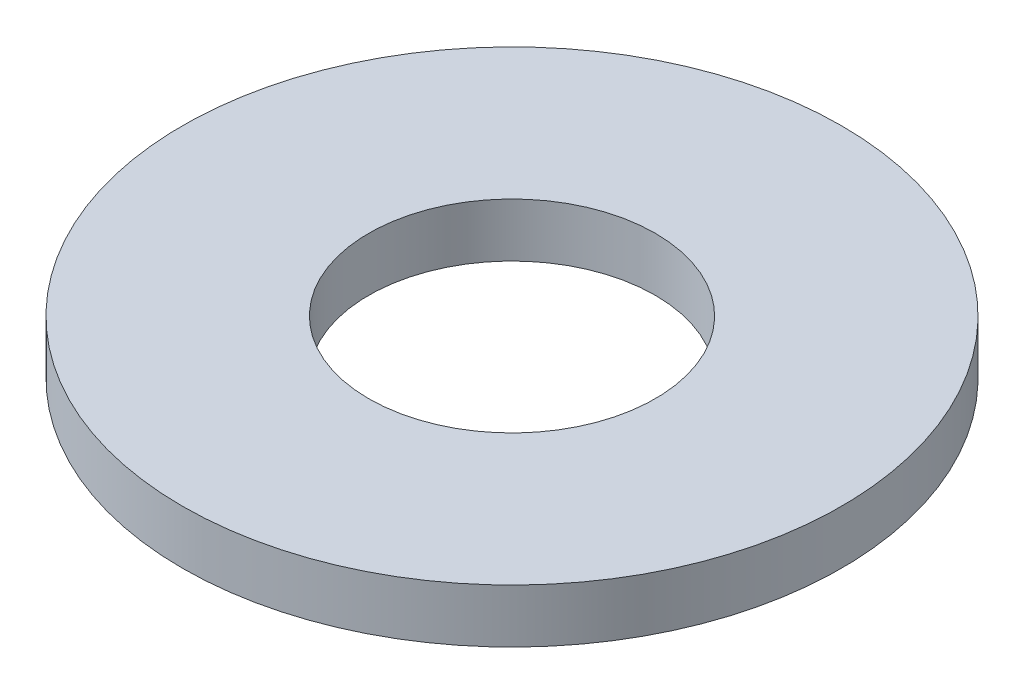
ISO-10303-21;
HEADER;
FILE_DESCRIPTION(('STEP AP214'),'2;1');
FILE_NAME('part.step','',(''),(''),'','','');
FILE_SCHEMA(('AUTOMOTIVE_DESIGN { 1 0 10303 214 1 1 1 1 }'));
ENDSEC;
DATA;
#1=APPLICATION_CONTEXT('core data for automotive mechanical design processes');
#2=APPLICATION_PROTOCOL_DEFINITION('international standard','automotive_design',2000,#1);
#3=PRODUCT_CONTEXT('',#1,'mechanical');
#4=PRODUCT('Part','Part','',(#3));
#5=PRODUCT_RELATED_PRODUCT_CATEGORY('part','',(#4));
#6=PRODUCT_DEFINITION_FORMATION('','',#4);
#7=PRODUCT_DEFINITION_CONTEXT('part definition',#1,'design');
#8=PRODUCT_DEFINITION('design','',#6,#7);
#9=PRODUCT_DEFINITION_SHAPE('','',#8);
#10=(LENGTH_UNIT() NAMED_UNIT(*) SI_UNIT(.MILLI.,.METRE.));
#11=(NAMED_UNIT(*) PLANE_ANGLE_UNIT() SI_UNIT($,.RADIAN.));
#12=(NAMED_UNIT(*) SI_UNIT($,.STERADIAN.) SOLID_ANGLE_UNIT());
#13=UNCERTAINTY_MEASURE_WITH_UNIT(LENGTH_MEASURE(1.E-05),#10,'distance_accuracy_value','');
#14=(GEOMETRIC_REPRESENTATION_CONTEXT(3) GLOBAL_UNCERTAINTY_ASSIGNED_CONTEXT((#13)) GLOBAL_UNIT_ASSIGNED_CONTEXT((#10,
#11,#12)) REPRESENTATION_CONTEXT('',''));
#15=CARTESIAN_POINT('',(0.,0.,0.));
#16=DIRECTION('',(0.,0.,1.));
#17=DIRECTION('',(1.,0.,0.));
#18=AXIS2_PLACEMENT_3D('',#15,#16,#17);
#19=CARTESIAN_POINT('',(0.,1.524,0.));
#20=DIRECTION('',(0.,1.,0.));
#21=DIRECTION('',(0.,0.,1.));
#22=AXIS2_PLACEMENT_3D('',#19,#20,#21);
#23=PLANE('',#22);
#24=CARTESIAN_POINT('',(0.,1.524,0.));
#25=DIRECTION('',(0.,1.,0.));
#26=DIRECTION('',(0.,0.,1.));
#27=AXIS2_PLACEMENT_3D('',#24,#25,#26);
#28=CIRCLE('',#27,4.064);
#29=CARTESIAN_POINT('',(0.,1.524,4.064));
#30=VERTEX_POINT('',#29);
#31=EDGE_CURVE('E26',#30,#30,#28,.F.);
#32=ORIENTED_EDGE('',*,*,#31,.T.);
#33=EDGE_LOOP('',(#32));
#34=FACE_BOUND('',#33,.T.);
#35=CARTESIAN_POINT('',(0.,1.524,0.));
#36=DIRECTION('',(0.,1.,0.));
#37=DIRECTION('',(0.,0.,1.));
#38=AXIS2_PLACEMENT_3D('',#35,#36,#37);
#39=CIRCLE('',#38,9.3472);
#40=CARTESIAN_POINT('',(0.,1.524,9.3472));
#41=VERTEX_POINT('',#40);
#42=EDGE_CURVE('E17',#41,#41,#39,.F.);
#43=ORIENTED_EDGE('',*,*,#42,.F.);
#44=EDGE_LOOP('',(#43));
#45=FACE_BOUND('',#44,.T.);
#46=ADVANCED_FACE('F14',(#34,#45),#23,.T.);
#47=CARTESIAN_POINT('',(0.,0.,0.));
#48=DIRECTION('',(0.,1.,0.));
#49=DIRECTION('',(0.,0.,1.));
#50=AXIS2_PLACEMENT_3D('',#47,#48,#49);
#51=CYLINDRICAL_SURFACE('',#50,9.3472);
#52=ORIENTED_EDGE('',*,*,#42,.T.);
#53=EDGE_LOOP('',(#52));
#54=FACE_BOUND('',#53,.T.);
#55=CARTESIAN_POINT('',(0.,0.,0.));
#56=DIRECTION('',(0.,1.,0.));
#57=DIRECTION('',(0.,0.,1.));
#58=AXIS2_PLACEMENT_3D('',#55,#56,#57);
#59=CIRCLE('',#58,9.3472);
#60=CARTESIAN_POINT('',(0.,0.,9.3472));
#61=VERTEX_POINT('',#60);
#62=EDGE_CURVE('E21',#61,#61,#59,.T.);
#63=ORIENTED_EDGE('',*,*,#62,.T.);
#64=EDGE_LOOP('',(#63));
#65=FACE_BOUND('',#64,.T.);
#66=ADVANCED_FACE('F34',(#54,#65),#51,.T.);
#67=CARTESIAN_POINT('',(0.,0.,0.));
#68=DIRECTION('',(0.,1.,0.));
#69=DIRECTION('',(0.,0.,1.));
#70=AXIS2_PLACEMENT_3D('',#67,#68,#69);
#71=CYLINDRICAL_SURFACE('',#70,4.064);
#72=ORIENTED_EDGE('',*,*,#31,.F.);
#73=EDGE_LOOP('',(#72));
#74=FACE_BOUND('',#73,.T.);
#75=CARTESIAN_POINT('',(0.,0.,0.));
#76=DIRECTION('',(0.,1.,0.));
#77=DIRECTION('',(0.,0.,1.));
#78=AXIS2_PLACEMENT_3D('',#75,#76,#77);
#79=CIRCLE('',#78,4.064);
#80=CARTESIAN_POINT('',(0.,0.,4.064));
#81=VERTEX_POINT('',#80);
#82=EDGE_CURVE('E10',#81,#81,#79,.F.);
#83=ORIENTED_EDGE('',*,*,#82,.T.);
#84=EDGE_LOOP('',(#83));
#85=FACE_BOUND('',#84,.T.);
#86=ADVANCED_FACE('F42',(#74,#85),#71,.F.);
#87=CARTESIAN_POINT('',(0.,0.,0.));
#88=DIRECTION('',(0.,1.,0.));
#89=DIRECTION('',(0.,0.,1.));
#90=AXIS2_PLACEMENT_3D('',#87,#88,#89);
#91=PLANE('',#90);
#92=ORIENTED_EDGE('',*,*,#82,.F.);
#93=EDGE_LOOP('',(#92));
#94=FACE_BOUND('',#93,.T.);
#95=ORIENTED_EDGE('',*,*,#62,.F.);
#96=EDGE_LOOP('',(#95));
#97=FACE_BOUND('',#96,.T.);
#98=ADVANCED_FACE('F43',(#94,#97),#91,.F.);
#99=CLOSED_SHELL('',(#46,#66,#86,#98));
#100=MANIFOLD_SOLID_BREP('B1',#99);
#101=ADVANCED_BREP_SHAPE_REPRESENTATION('',(#18,#100),#14);
#102=SHAPE_DEFINITION_REPRESENTATION(#9,#101);
ENDSEC;
END-ISO-10303-21;
